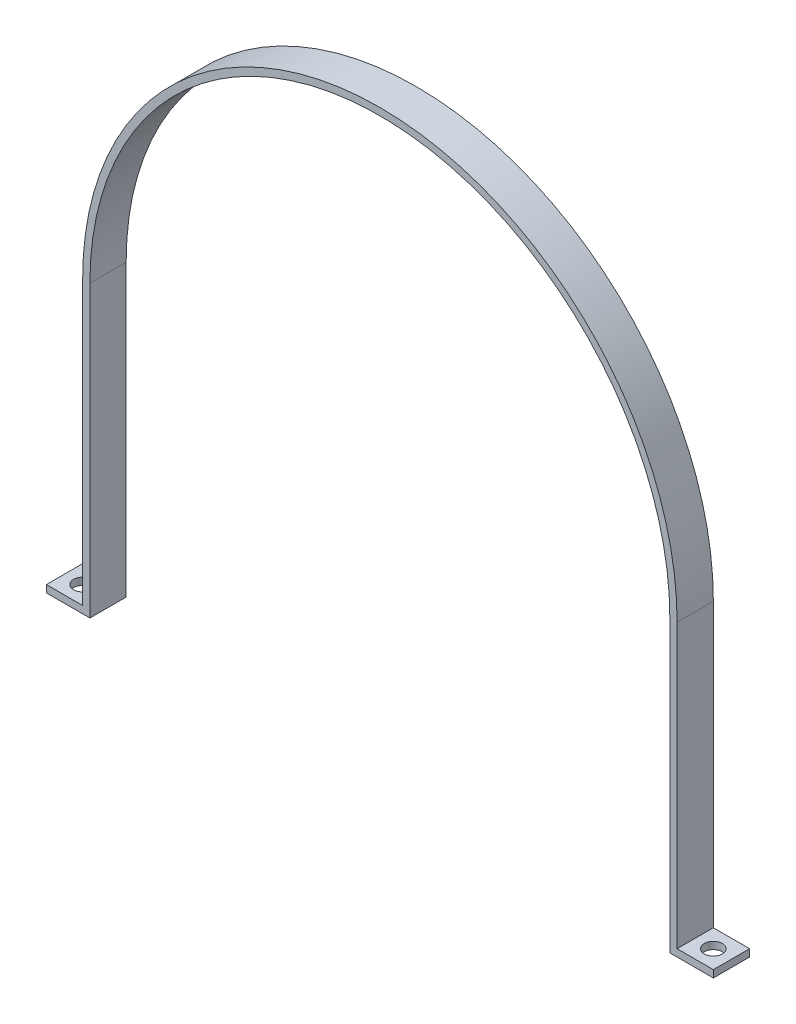
ISO-10303-21;
HEADER;
FILE_DESCRIPTION(('STEP AP214'),'2;1');
FILE_NAME('part.step','',(''),(''),'','','');
FILE_SCHEMA(('AUTOMOTIVE_DESIGN { 1 0 10303 214 1 1 1 1 }'));
ENDSEC;
DATA;
#1=APPLICATION_CONTEXT('core data for automotive mechanical design processes');
#2=APPLICATION_PROTOCOL_DEFINITION('international standard','automotive_design',2000,#1);
#3=PRODUCT_CONTEXT('',#1,'mechanical');
#4=PRODUCT('Part','Part','',(#3));
#5=PRODUCT_RELATED_PRODUCT_CATEGORY('part','',(#4));
#6=PRODUCT_DEFINITION_FORMATION('','',#4);
#7=PRODUCT_DEFINITION_CONTEXT('part definition',#1,'design');
#8=PRODUCT_DEFINITION('design','',#6,#7);
#9=PRODUCT_DEFINITION_SHAPE('','',#8);
#10=(LENGTH_UNIT() NAMED_UNIT(*) SI_UNIT(.MILLI.,.METRE.));
#11=(NAMED_UNIT(*) PLANE_ANGLE_UNIT() SI_UNIT($,.RADIAN.));
#12=(NAMED_UNIT(*) SI_UNIT($,.STERADIAN.) SOLID_ANGLE_UNIT());
#13=UNCERTAINTY_MEASURE_WITH_UNIT(LENGTH_MEASURE(1.E-05),#10,'distance_accuracy_value','');
#14=(GEOMETRIC_REPRESENTATION_CONTEXT(3) GLOBAL_UNCERTAINTY_ASSIGNED_CONTEXT((#13)) GLOBAL_UNIT_ASSIGNED_CONTEXT((#10,
#11,#12)) REPRESENTATION_CONTEXT('',''));
#15=CARTESIAN_POINT('',(0.,0.,0.));
#16=DIRECTION('',(0.,0.,1.));
#17=DIRECTION('',(1.,0.,0.));
#18=AXIS2_PLACEMENT_3D('',#15,#16,#17);
#19=CARTESIAN_POINT('',(80.,-80.,10.));
#20=DIRECTION('',(-1.,0.,0.));
#21=DIRECTION('',(0.,0.,1.));
#22=AXIS2_PLACEMENT_3D('',#19,#20,#21);
#23=PLANE('',#22);
#24=DIRECTION('',(0.,1.,0.));
#25=VECTOR('',#24,1.);
#26=CARTESIAN_POINT('',(80.,-80.,0.));
#27=LINE('',#26,#25);
#28=CARTESIAN_POINT('',(80.,-80.,0.));
#29=VERTEX_POINT('',#28);
#30=CARTESIAN_POINT('',(80.,0.,0.));
#31=VERTEX_POINT('',#30);
#32=EDGE_CURVE('E165',#29,#31,#27,.T.);
#33=ORIENTED_EDGE('',*,*,#32,.F.);
#34=DIRECTION('',(0.,0.,-1.));
#35=VECTOR('',#34,1.);
#36=CARTESIAN_POINT('',(80.,-80.,10.));
#37=LINE('',#36,#35);
#38=CARTESIAN_POINT('',(80.,-80.,10.));
#39=VERTEX_POINT('',#38);
#40=EDGE_CURVE('E11',#39,#29,#37,.T.);
#41=ORIENTED_EDGE('',*,*,#40,.F.);
#42=DIRECTION('',(0.,1.,0.));
#43=VECTOR('',#42,1.);
#44=CARTESIAN_POINT('',(80.,-80.,10.));
#45=LINE('',#44,#43);
#46=CARTESIAN_POINT('',(80.,0.,10.));
#47=VERTEX_POINT('',#46);
#48=EDGE_CURVE('E194',#39,#47,#45,.T.);
#49=ORIENTED_EDGE('',*,*,#48,.T.);
#50=DIRECTION('',(0.,0.,-1.));
#51=VECTOR('',#50,1.);
#52=CARTESIAN_POINT('',(80.,0.,10.));
#53=LINE('',#52,#51);
#54=EDGE_CURVE('E46',#47,#31,#53,.T.);
#55=ORIENTED_EDGE('',*,*,#54,.T.);
#56=EDGE_LOOP('',(#33,#41,#49,#55));
#57=FACE_BOUND('',#56,.T.);
#58=ADVANCED_FACE('F43',(#57),#23,.T.);
#59=CARTESIAN_POINT('',(80.,-80.,10.));
#60=DIRECTION('',(0.,1.,0.));
#61=DIRECTION('',(0.,0.,1.));
#62=AXIS2_PLACEMENT_3D('',#59,#60,#61);
#63=PLANE('',#62);
#64=CARTESIAN_POINT('',(87.,-80.,5.));
#65=DIRECTION('',(0.,-1.,0.));
#66=DIRECTION('',(0.,0.,-1.));
#67=AXIS2_PLACEMENT_3D('',#64,#65,#66);
#68=CIRCLE('',#67,2.5);
#69=CARTESIAN_POINT('',(87.,-80.,2.5));
#70=VERTEX_POINT('',#69);
#71=EDGE_CURVE('E255',#70,#70,#68,.T.);
#72=ORIENTED_EDGE('',*,*,#71,.F.);
#73=EDGE_LOOP('',(#72));
#74=FACE_BOUND('',#73,.T.);
#75=DIRECTION('',(1.,0.,0.));
#76=VECTOR('',#75,1.);
#77=CARTESIAN_POINT('',(80.,-80.,0.));
#78=LINE('',#77,#76);
#79=CARTESIAN_POINT('',(92.,-80.,0.));
#80=VERTEX_POINT('',#79);
#81=EDGE_CURVE('E100',#29,#80,#78,.T.);
#82=ORIENTED_EDGE('',*,*,#81,.T.);
#83=DIRECTION('',(0.,0.,-1.));
#84=VECTOR('',#83,1.);
#85=CARTESIAN_POINT('',(92.,-80.,10.));
#86=LINE('',#85,#84);
#87=CARTESIAN_POINT('',(92.,-80.,10.));
#88=VERTEX_POINT('',#87);
#89=EDGE_CURVE('E52',#88,#80,#86,.T.);
#90=ORIENTED_EDGE('',*,*,#89,.F.);
#91=DIRECTION('',(1.,0.,0.));
#92=VECTOR('',#91,1.);
#93=CARTESIAN_POINT('',(80.,-80.,10.));
#94=LINE('',#93,#92);
#95=EDGE_CURVE('E143',#39,#88,#94,.T.);
#96=ORIENTED_EDGE('',*,*,#95,.F.);
#97=ORIENTED_EDGE('',*,*,#40,.T.);
#98=EDGE_LOOP('',(#82,#90,#96,#97));
#99=FACE_BOUND('',#98,.T.);
#100=ADVANCED_FACE('F269',(#74,#99),#63,.F.);
#101=CARTESIAN_POINT('',(92.,-80.,10.));
#102=DIRECTION('',(-1.,0.,0.));
#103=DIRECTION('',(0.,0.,1.));
#104=AXIS2_PLACEMENT_3D('',#101,#102,#103);
#105=PLANE('',#104);
#106=DIRECTION('',(0.,1.,0.));
#107=VECTOR('',#106,1.);
#108=CARTESIAN_POINT('',(92.,-80.,0.));
#109=LINE('',#108,#107);
#110=CARTESIAN_POINT('',(92.,-78.,0.));
#111=VERTEX_POINT('',#110);
#112=EDGE_CURVE('E150',#80,#111,#109,.T.);
#113=ORIENTED_EDGE('',*,*,#112,.T.);
#114=DIRECTION('',(0.,0.,-1.));
#115=VECTOR('',#114,1.);
#116=CARTESIAN_POINT('',(92.,-78.,10.));
#117=LINE('',#116,#115);
#118=CARTESIAN_POINT('',(92.,-78.,10.));
#119=VERTEX_POINT('',#118);
#120=EDGE_CURVE('E147',#119,#111,#117,.T.);
#121=ORIENTED_EDGE('',*,*,#120,.F.);
#122=DIRECTION('',(0.,1.,0.));
#123=VECTOR('',#122,1.);
#124=CARTESIAN_POINT('',(92.,-80.,10.));
#125=LINE('',#124,#123);
#126=EDGE_CURVE('E136',#88,#119,#125,.T.);
#127=ORIENTED_EDGE('',*,*,#126,.F.);
#128=ORIENTED_EDGE('',*,*,#89,.T.);
#129=EDGE_LOOP('',(#113,#121,#127,#128));
#130=FACE_BOUND('',#129,.T.);
#131=ADVANCED_FACE('F148',(#130),#105,.F.);
#132=CARTESIAN_POINT('',(92.,-78.,10.));
#133=DIRECTION('',(0.,-1.,0.));
#134=DIRECTION('',(0.,0.,-1.));
#135=AXIS2_PLACEMENT_3D('',#132,#133,#134);
#136=PLANE('',#135);
#137=CARTESIAN_POINT('',(87.,-78.,5.));
#138=DIRECTION('',(0.,-1.,0.));
#139=DIRECTION('',(0.,0.,-1.));
#140=AXIS2_PLACEMENT_3D('',#137,#138,#139);
#141=CIRCLE('',#140,2.5);
#142=CARTESIAN_POINT('',(87.,-78.,2.5));
#143=VERTEX_POINT('',#142);
#144=EDGE_CURVE('E169',#143,#143,#141,.T.);
#145=ORIENTED_EDGE('',*,*,#144,.T.);
#146=EDGE_LOOP('',(#145));
#147=FACE_BOUND('',#146,.T.);
#148=DIRECTION('',(-1.,0.,0.));
#149=VECTOR('',#148,1.);
#150=CARTESIAN_POINT('',(92.,-78.,0.));
#151=LINE('',#150,#149);
#152=CARTESIAN_POINT('',(82.,-78.,0.));
#153=VERTEX_POINT('',#152);
#154=EDGE_CURVE('E191',#111,#153,#151,.T.);
#155=ORIENTED_EDGE('',*,*,#154,.T.);
#156=DIRECTION('',(0.,0.,-1.));
#157=VECTOR('',#156,1.);
#158=CARTESIAN_POINT('',(82.,-78.,10.));
#159=LINE('',#158,#157);
#160=CARTESIAN_POINT('',(82.,-78.,10.));
#161=VERTEX_POINT('',#160);
#162=EDGE_CURVE('E153',#161,#153,#159,.T.);
#163=ORIENTED_EDGE('',*,*,#162,.F.);
#164=DIRECTION('',(-1.,0.,0.));
#165=VECTOR('',#164,1.);
#166=CARTESIAN_POINT('',(92.,-78.,10.));
#167=LINE('',#166,#165);
#168=EDGE_CURVE('E141',#119,#161,#167,.T.);
#169=ORIENTED_EDGE('',*,*,#168,.F.);
#170=ORIENTED_EDGE('',*,*,#120,.T.);
#171=EDGE_LOOP('',(#155,#163,#169,#170));
#172=FACE_BOUND('',#171,.T.);
#173=ADVANCED_FACE('F155',(#147,#172),#136,.F.);
#174=CARTESIAN_POINT('',(82.,-78.,10.));
#175=DIRECTION('',(-1.,0.,0.));
#176=DIRECTION('',(0.,0.,1.));
#177=AXIS2_PLACEMENT_3D('',#174,#175,#176);
#178=PLANE('',#177);
#179=DIRECTION('',(0.,1.,0.));
#180=VECTOR('',#179,1.);
#181=CARTESIAN_POINT('',(82.,-78.,0.));
#182=LINE('',#181,#180);
#183=CARTESIAN_POINT('',(82.,0.,0.));
#184=VERTEX_POINT('',#183);
#185=EDGE_CURVE('E189',#153,#184,#182,.T.);
#186=ORIENTED_EDGE('',*,*,#185,.T.);
#187=DIRECTION('',(0.,0.,-1.));
#188=VECTOR('',#187,1.);
#189=CARTESIAN_POINT('',(82.,0.,10.));
#190=LINE('',#189,#188);
#191=CARTESIAN_POINT('',(82.,0.,10.));
#192=VERTEX_POINT('',#191);
#193=EDGE_CURVE('E198',#192,#184,#190,.T.);
#194=ORIENTED_EDGE('',*,*,#193,.F.);
#195=DIRECTION('',(0.,1.,0.));
#196=VECTOR('',#195,1.);
#197=CARTESIAN_POINT('',(82.,-78.,10.));
#198=LINE('',#197,#196);
#199=EDGE_CURVE('E158',#161,#192,#198,.T.);
#200=ORIENTED_EDGE('',*,*,#199,.F.);
#201=ORIENTED_EDGE('',*,*,#162,.T.);
#202=EDGE_LOOP('',(#186,#194,#200,#201));
#203=FACE_BOUND('',#202,.T.);
#204=ADVANCED_FACE('F219',(#203),#178,.F.);
#205=CARTESIAN_POINT('',(0.,0.,10.));
#206=DIRECTION('',(0.,0.,-1.));
#207=DIRECTION('',(-1.,0.,0.));
#208=AXIS2_PLACEMENT_3D('',#205,#206,#207);
#209=CYLINDRICAL_SURFACE('',#208,82.);
#210=CARTESIAN_POINT('',(0.,0.,0.));
#211=DIRECTION('',(0.,0.,1.));
#212=DIRECTION('',(1.,0.,0.));
#213=AXIS2_PLACEMENT_3D('',#210,#211,#212);
#214=CIRCLE('',#213,82.);
#215=CARTESIAN_POINT('',(-82.,0.,0.));
#216=VERTEX_POINT('',#215);
#217=EDGE_CURVE('E187',#184,#216,#214,.T.);
#218=ORIENTED_EDGE('',*,*,#217,.T.);
#219=DIRECTION('',(0.,0.,-1.));
#220=VECTOR('',#219,1.);
#221=CARTESIAN_POINT('',(-82.,0.,10.));
#222=LINE('',#221,#220);
#223=CARTESIAN_POINT('',(-82.,0.,10.));
#224=VERTEX_POINT('',#223);
#225=EDGE_CURVE('E201',#224,#216,#222,.T.);
#226=ORIENTED_EDGE('',*,*,#225,.F.);
#227=CARTESIAN_POINT('',(0.,0.,10.));
#228=DIRECTION('',(0.,0.,1.));
#229=DIRECTION('',(1.,0.,0.));
#230=AXIS2_PLACEMENT_3D('',#227,#228,#229);
#231=CIRCLE('',#230,82.);
#232=EDGE_CURVE('E160',#192,#224,#231,.T.);
#233=ORIENTED_EDGE('',*,*,#232,.F.);
#234=ORIENTED_EDGE('',*,*,#193,.T.);
#235=EDGE_LOOP('',(#218,#226,#233,#234));
#236=FACE_BOUND('',#235,.T.);
#237=ADVANCED_FACE('F228',(#236),#209,.T.);
#238=CARTESIAN_POINT('',(-82.,0.,10.));
#239=DIRECTION('',(1.,0.,0.));
#240=DIRECTION('',(0.,0.,-1.));
#241=AXIS2_PLACEMENT_3D('',#238,#239,#240);
#242=PLANE('',#241);
#243=DIRECTION('',(0.,-1.,0.));
#244=VECTOR('',#243,1.);
#245=CARTESIAN_POINT('',(-82.,0.,0.));
#246=LINE('',#245,#244);
#247=CARTESIAN_POINT('',(-82.,-77.9999999999999,0.));
#248=VERTEX_POINT('',#247);
#249=EDGE_CURVE('E184',#216,#248,#246,.T.);
#250=ORIENTED_EDGE('',*,*,#249,.T.);
#251=DIRECTION('',(0.,0.,-1.));
#252=VECTOR('',#251,1.);
#253=CARTESIAN_POINT('',(-82.,-77.9999999999999,10.));
#254=LINE('',#253,#252);
#255=CARTESIAN_POINT('',(-82.,-77.9999999999999,10.));
#256=VERTEX_POINT('',#255);
#257=EDGE_CURVE('E204',#256,#248,#254,.T.);
#258=ORIENTED_EDGE('',*,*,#257,.F.);
#259=DIRECTION('',(0.,-1.,0.));
#260=VECTOR('',#259,1.);
#261=CARTESIAN_POINT('',(-82.,0.,10.));
#262=LINE('',#261,#260);
#263=EDGE_CURVE('E225',#224,#256,#262,.T.);
#264=ORIENTED_EDGE('',*,*,#263,.F.);
#265=ORIENTED_EDGE('',*,*,#225,.T.);
#266=EDGE_LOOP('',(#250,#258,#264,#265));
#267=FACE_BOUND('',#266,.T.);
#268=ADVANCED_FACE('F231',(#267),#242,.F.);
#269=CARTESIAN_POINT('',(-92.,-77.9999999999999,10.));
#270=DIRECTION('',(0.,1.,0.));
#271=DIRECTION('',(0.,0.,1.));
#272=AXIS2_PLACEMENT_3D('',#269,#270,#271);
#273=PLANE('',#272);
#274=CARTESIAN_POINT('',(-87.,-78.,5.));
#275=DIRECTION('',(0.,-1.,0.));
#276=DIRECTION('',(0.,0.,1.));
#277=AXIS2_PLACEMENT_3D('',#274,#275,#276);
#278=CIRCLE('',#277,2.5);
#279=CARTESIAN_POINT('',(-87.,-78.,7.5));
#280=VERTEX_POINT('',#279);
#281=EDGE_CURVE('E249',#280,#280,#278,.T.);
#282=ORIENTED_EDGE('',*,*,#281,.T.);
#283=EDGE_LOOP('',(#282));
#284=FACE_BOUND('',#283,.T.);
#285=DIRECTION('',(1.,0.,0.));
#286=VECTOR('',#285,1.);
#287=CARTESIAN_POINT('',(-92.,-77.9999999999999,0.));
#288=LINE('',#287,#286);
#289=CARTESIAN_POINT('',(-92.,-77.9999999999999,0.));
#290=VERTEX_POINT('',#289);
#291=EDGE_CURVE('E181',#290,#248,#288,.T.);
#292=ORIENTED_EDGE('',*,*,#291,.F.);
#293=DIRECTION('',(0.,0.,-1.));
#294=VECTOR('',#293,1.);
#295=CARTESIAN_POINT('',(-92.,-77.9999999999999,10.));
#296=LINE('',#295,#294);
#297=CARTESIAN_POINT('',(-92.,-77.9999999999999,10.));
#298=VERTEX_POINT('',#297);
#299=EDGE_CURVE('E206',#298,#290,#296,.T.);
#300=ORIENTED_EDGE('',*,*,#299,.F.);
#301=DIRECTION('',(1.,0.,0.));
#302=VECTOR('',#301,1.);
#303=CARTESIAN_POINT('',(-92.,-77.9999999999999,10.));
#304=LINE('',#303,#302);
#305=EDGE_CURVE('E233',#298,#256,#304,.T.);
#306=ORIENTED_EDGE('',*,*,#305,.T.);
#307=ORIENTED_EDGE('',*,*,#257,.T.);
#308=EDGE_LOOP('',(#292,#300,#306,#307));
#309=FACE_BOUND('',#308,.T.);
#310=ADVANCED_FACE('F289',(#284,#309),#273,.T.);
#311=CARTESIAN_POINT('',(-92.,-79.9999999999999,10.));
#312=DIRECTION('',(-1.,0.,0.));
#313=DIRECTION('',(0.,0.,1.));
#314=AXIS2_PLACEMENT_3D('',#311,#312,#313);
#315=PLANE('',#314);
#316=DIRECTION('',(0.,1.,0.));
#317=VECTOR('',#316,1.);
#318=CARTESIAN_POINT('',(-92.,-79.9999999999999,0.));
#319=LINE('',#318,#317);
#320=CARTESIAN_POINT('',(-92.,-79.9999999999999,0.));
#321=VERTEX_POINT('',#320);
#322=EDGE_CURVE('E178',#321,#290,#319,.T.);
#323=ORIENTED_EDGE('',*,*,#322,.F.);
#324=DIRECTION('',(0.,0.,-1.));
#325=VECTOR('',#324,1.);
#326=CARTESIAN_POINT('',(-92.,-79.9999999999999,10.));
#327=LINE('',#326,#325);
#328=CARTESIAN_POINT('',(-92.,-79.9999999999999,10.));
#329=VERTEX_POINT('',#328);
#330=EDGE_CURVE('E208',#329,#321,#327,.T.);
#331=ORIENTED_EDGE('',*,*,#330,.F.);
#332=DIRECTION('',(0.,1.,0.));
#333=VECTOR('',#332,1.);
#334=CARTESIAN_POINT('',(-92.,-79.9999999999999,10.));
#335=LINE('',#334,#333);
#336=EDGE_CURVE('E235',#329,#298,#335,.T.);
#337=ORIENTED_EDGE('',*,*,#336,.T.);
#338=ORIENTED_EDGE('',*,*,#299,.T.);
#339=EDGE_LOOP('',(#323,#331,#337,#338));
#340=FACE_BOUND('',#339,.T.);
#341=ADVANCED_FACE('F292',(#340),#315,.T.);
#342=CARTESIAN_POINT('',(-80.,-80.,10.));
#343=DIRECTION('',(0.,-1.,0.));
#344=DIRECTION('',(1.,0.,0.));
#345=AXIS2_PLACEMENT_3D('',#342,#343,#344);
#346=PLANE('',#345);
#347=CARTESIAN_POINT('',(-87.,-80.,5.));
#348=DIRECTION('',(0.,-1.,0.));
#349=DIRECTION('',(0.,0.,1.));
#350=AXIS2_PLACEMENT_3D('',#347,#348,#349);
#351=CIRCLE('',#350,2.5);
#352=CARTESIAN_POINT('',(-87.,-80.,7.5));
#353=VERTEX_POINT('',#352);
#354=EDGE_CURVE('E252',#353,#353,#351,.T.);
#355=ORIENTED_EDGE('',*,*,#354,.F.);
#356=EDGE_LOOP('',(#355));
#357=FACE_BOUND('',#356,.T.);
#358=DIRECTION('',(-1.,0.,0.));
#359=VECTOR('',#358,1.);
#360=CARTESIAN_POINT('',(-80.,-80.,0.));
#361=LINE('',#360,#359);
#362=CARTESIAN_POINT('',(-80.,-80.,0.));
#363=VERTEX_POINT('',#362);
#364=EDGE_CURVE('E175',#363,#321,#361,.T.);
#365=ORIENTED_EDGE('',*,*,#364,.F.);
#366=DIRECTION('',(0.,0.,-1.));
#367=VECTOR('',#366,1.);
#368=CARTESIAN_POINT('',(-80.,-80.,10.));
#369=LINE('',#368,#367);
#370=CARTESIAN_POINT('',(-80.,-80.,10.));
#371=VERTEX_POINT('',#370);
#372=EDGE_CURVE('E210',#371,#363,#369,.T.);
#373=ORIENTED_EDGE('',*,*,#372,.F.);
#374=DIRECTION('',(-1.,0.,0.));
#375=VECTOR('',#374,1.);
#376=CARTESIAN_POINT('',(-80.,-80.,10.));
#377=LINE('',#376,#375);
#378=EDGE_CURVE('E240',#371,#329,#377,.T.);
#379=ORIENTED_EDGE('',*,*,#378,.T.);
#380=ORIENTED_EDGE('',*,*,#330,.T.);
#381=EDGE_LOOP('',(#365,#373,#379,#380));
#382=FACE_BOUND('',#381,.T.);
#383=ADVANCED_FACE('F296',(#357,#382),#346,.T.);
#384=CARTESIAN_POINT('',(-80.,0.,10.));
#385=DIRECTION('',(1.,0.,0.));
#386=DIRECTION('',(0.,0.,-1.));
#387=AXIS2_PLACEMENT_3D('',#384,#385,#386);
#388=PLANE('',#387);
#389=DIRECTION('',(0.,-1.,0.));
#390=VECTOR('',#389,1.);
#391=CARTESIAN_POINT('',(-80.,0.,0.));
#392=LINE('',#391,#390);
#393=CARTESIAN_POINT('',(-80.,0.,0.));
#394=VERTEX_POINT('',#393);
#395=EDGE_CURVE('E172',#394,#363,#392,.T.);
#396=ORIENTED_EDGE('',*,*,#395,.F.);
#397=DIRECTION('',(0.,0.,-1.));
#398=VECTOR('',#397,1.);
#399=CARTESIAN_POINT('',(-80.,0.,10.));
#400=LINE('',#399,#398);
#401=CARTESIAN_POINT('',(-80.,0.,10.));
#402=VERTEX_POINT('',#401);
#403=EDGE_CURVE('E211',#402,#394,#400,.T.);
#404=ORIENTED_EDGE('',*,*,#403,.F.);
#405=DIRECTION('',(0.,-1.,0.));
#406=VECTOR('',#405,1.);
#407=CARTESIAN_POINT('',(-80.,0.,10.));
#408=LINE('',#407,#406);
#409=EDGE_CURVE('E243',#402,#371,#408,.T.);
#410=ORIENTED_EDGE('',*,*,#409,.T.);
#411=ORIENTED_EDGE('',*,*,#372,.T.);
#412=EDGE_LOOP('',(#396,#404,#410,#411));
#413=FACE_BOUND('',#412,.T.);
#414=ADVANCED_FACE('F300',(#413),#388,.T.);
#415=CARTESIAN_POINT('',(0.,0.,10.));
#416=DIRECTION('',(0.,0.,-1.));
#417=DIRECTION('',(-1.,0.,0.));
#418=AXIS2_PLACEMENT_3D('',#415,#416,#417);
#419=CYLINDRICAL_SURFACE('',#418,80.);
#420=CARTESIAN_POINT('',(0.,0.,0.));
#421=DIRECTION('',(0.,0.,1.));
#422=DIRECTION('',(1.,0.,0.));
#423=AXIS2_PLACEMENT_3D('',#420,#421,#422);
#424=CIRCLE('',#423,80.);
#425=EDGE_CURVE('E168',#31,#394,#424,.T.);
#426=ORIENTED_EDGE('',*,*,#425,.F.);
#427=ORIENTED_EDGE('',*,*,#54,.F.);
#428=CARTESIAN_POINT('',(0.,0.,10.));
#429=DIRECTION('',(0.,0.,1.));
#430=DIRECTION('',(1.,0.,0.));
#431=AXIS2_PLACEMENT_3D('',#428,#429,#430);
#432=CIRCLE('',#431,80.);
#433=EDGE_CURVE('E246',#47,#402,#432,.T.);
#434=ORIENTED_EDGE('',*,*,#433,.T.);
#435=ORIENTED_EDGE('',*,*,#403,.T.);
#436=EDGE_LOOP('',(#426,#427,#434,#435));
#437=FACE_BOUND('',#436,.T.);
#438=ADVANCED_FACE('F213',(#437),#419,.F.);
#439=CARTESIAN_POINT('',(0.,0.,10.));
#440=DIRECTION('',(0.,0.,1.));
#441=DIRECTION('',(1.,0.,0.));
#442=AXIS2_PLACEMENT_3D('',#439,#440,#441);
#443=PLANE('',#442);
#444=ORIENTED_EDGE('',*,*,#48,.F.);
#445=ORIENTED_EDGE('',*,*,#95,.T.);
#446=ORIENTED_EDGE('',*,*,#126,.T.);
#447=ORIENTED_EDGE('',*,*,#168,.T.);
#448=ORIENTED_EDGE('',*,*,#199,.T.);
#449=ORIENTED_EDGE('',*,*,#232,.T.);
#450=ORIENTED_EDGE('',*,*,#263,.T.);
#451=ORIENTED_EDGE('',*,*,#305,.F.);
#452=ORIENTED_EDGE('',*,*,#336,.F.);
#453=ORIENTED_EDGE('',*,*,#378,.F.);
#454=ORIENTED_EDGE('',*,*,#409,.F.);
#455=ORIENTED_EDGE('',*,*,#433,.F.);
#456=EDGE_LOOP('',(#444,#445,#446,#447,#448,#449,#450,#451,#452,#453,#454,#455));
#457=FACE_BOUND('',#456,.T.);
#458=ADVANCED_FACE('F139',(#457),#443,.T.);
#459=CARTESIAN_POINT('',(0.,0.,0.));
#460=DIRECTION('',(0.,0.,1.));
#461=DIRECTION('',(1.,0.,0.));
#462=AXIS2_PLACEMENT_3D('',#459,#460,#461);
#463=PLANE('',#462);
#464=ORIENTED_EDGE('',*,*,#32,.T.);
#465=ORIENTED_EDGE('',*,*,#425,.T.);
#466=ORIENTED_EDGE('',*,*,#395,.T.);
#467=ORIENTED_EDGE('',*,*,#364,.T.);
#468=ORIENTED_EDGE('',*,*,#322,.T.);
#469=ORIENTED_EDGE('',*,*,#291,.T.);
#470=ORIENTED_EDGE('',*,*,#249,.F.);
#471=ORIENTED_EDGE('',*,*,#217,.F.);
#472=ORIENTED_EDGE('',*,*,#185,.F.);
#473=ORIENTED_EDGE('',*,*,#154,.F.);
#474=ORIENTED_EDGE('',*,*,#112,.F.);
#475=ORIENTED_EDGE('',*,*,#81,.F.);
#476=EDGE_LOOP('',(#464,#465,#466,#467,#468,#469,#470,#471,#472,#473,#474,#475));
#477=FACE_BOUND('',#476,.T.);
#478=ADVANCED_FACE('F215',(#477),#463,.F.);
#479=CARTESIAN_POINT('',(-87.,-78.,5.));
#480=DIRECTION('',(0.,-1.,0.));
#481=DIRECTION('',(0.,0.,-1.));
#482=AXIS2_PLACEMENT_3D('',#479,#480,#481);
#483=CYLINDRICAL_SURFACE('',#482,2.5);
#484=ORIENTED_EDGE('',*,*,#281,.F.);
#485=EDGE_LOOP('',(#484));
#486=FACE_BOUND('',#485,.T.);
#487=ORIENTED_EDGE('',*,*,#354,.T.);
#488=EDGE_LOOP('',(#487));
#489=FACE_BOUND('',#488,.T.);
#490=ADVANCED_FACE('F265',(#486,#489),#483,.F.);
#491=CARTESIAN_POINT('',(87.,-78.,5.));
#492=DIRECTION('',(0.,-1.,0.));
#493=DIRECTION('',(0.,0.,-1.));
#494=AXIS2_PLACEMENT_3D('',#491,#492,#493);
#495=CYLINDRICAL_SURFACE('',#494,2.5);
#496=ORIENTED_EDGE('',*,*,#144,.F.);
#497=EDGE_LOOP('',(#496));
#498=FACE_BOUND('',#497,.T.);
#499=ORIENTED_EDGE('',*,*,#71,.T.);
#500=EDGE_LOOP('',(#499));
#501=FACE_BOUND('',#500,.T.);
#502=ADVANCED_FACE('F262',(#498,#501),#495,.F.);
#503=CLOSED_SHELL('',(#58,#100,#131,#173,#204,#237,#268,#310,#341,#383,#414,#438,#458,#478,#490,#502));
#504=MANIFOLD_SOLID_BREP('B2',#503);
#505=ADVANCED_BREP_SHAPE_REPRESENTATION('',(#18,#504),#14);
#506=SHAPE_DEFINITION_REPRESENTATION(#9,#505);
ENDSEC;
END-ISO-10303-21;
